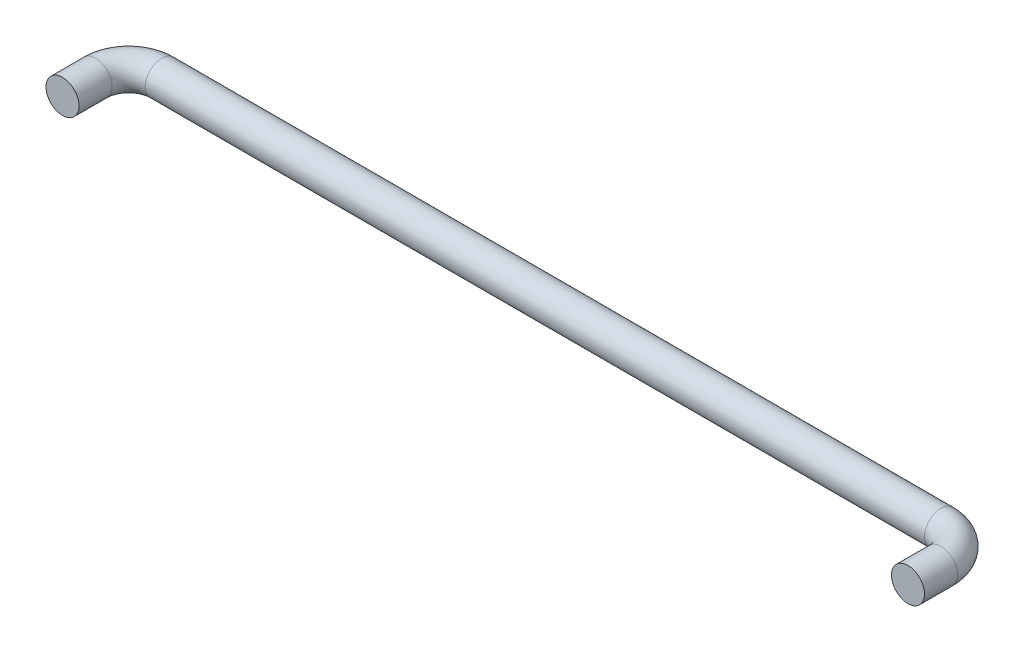
ISO-10303-21;
HEADER;
FILE_DESCRIPTION(('STEP AP214'),'2;1');
FILE_NAME('part.step','',(''),(''),'','','');
FILE_SCHEMA(('AUTOMOTIVE_DESIGN { 1 0 10303 214 1 1 1 1 }'));
ENDSEC;
DATA;
#1=APPLICATION_CONTEXT('core data for automotive mechanical design processes');
#2=APPLICATION_PROTOCOL_DEFINITION('international standard','automotive_design',2000,#1);
#3=PRODUCT_CONTEXT('',#1,'mechanical');
#4=PRODUCT('Part','Part','',(#3));
#5=PRODUCT_RELATED_PRODUCT_CATEGORY('part','',(#4));
#6=PRODUCT_DEFINITION_FORMATION('','',#4);
#7=PRODUCT_DEFINITION_CONTEXT('part definition',#1,'design');
#8=PRODUCT_DEFINITION('design','',#6,#7);
#9=PRODUCT_DEFINITION_SHAPE('','',#8);
#10=(LENGTH_UNIT() NAMED_UNIT(*) SI_UNIT(.MILLI.,.METRE.));
#11=(NAMED_UNIT(*) PLANE_ANGLE_UNIT() SI_UNIT($,.RADIAN.));
#12=(NAMED_UNIT(*) SI_UNIT($,.STERADIAN.) SOLID_ANGLE_UNIT());
#13=UNCERTAINTY_MEASURE_WITH_UNIT(LENGTH_MEASURE(1.E-05),#10,'distance_accuracy_value','');
#14=(GEOMETRIC_REPRESENTATION_CONTEXT(3) GLOBAL_UNCERTAINTY_ASSIGNED_CONTEXT((#13)) GLOBAL_UNIT_ASSIGNED_CONTEXT((#10,
#11,#12)) REPRESENTATION_CONTEXT('',''));
#15=CARTESIAN_POINT('',(0.,0.,0.));
#16=DIRECTION('',(0.,0.,1.));
#17=DIRECTION('',(1.,0.,0.));
#18=AXIS2_PLACEMENT_3D('',#15,#16,#17);
#19=CARTESIAN_POINT('',(0.,0.,0.));
#20=DIRECTION('',(0.,0.,1.));
#21=DIRECTION('',(1.,0.,0.));
#22=AXIS2_PLACEMENT_3D('',#19,#20,#21);
#23=PLANE('',#22);
#24=CARTESIAN_POINT('',(0.,0.,0.));
#25=DIRECTION('',(0.,0.,1.));
#26=DIRECTION('',(1.,0.,0.));
#27=AXIS2_PLACEMENT_3D('',#24,#25,#26);
#28=CIRCLE('',#27,25.);
#29=CARTESIAN_POINT('',(25.,0.,0.));
#30=VERTEX_POINT('',#29);
#31=EDGE_CURVE('E45',#30,#30,#28,.T.);
#32=ORIENTED_EDGE('',*,*,#31,.T.);
#33=EDGE_LOOP('',(#32));
#34=FACE_BOUND('',#33,.T.);
#35=ADVANCED_FACE('F33',(#34),#23,.T.);
#36=CARTESIAN_POINT('',(1278.6,0.,0.));
#37=DIRECTION('',(0.,0.,-1.));
#38=DIRECTION('',(-1.,0.,0.));
#39=AXIS2_PLACEMENT_3D('',#36,#37,#38);
#40=PLANE('',#39);
#41=CARTESIAN_POINT('',(1278.6,0.,0.));
#42=DIRECTION('',(0.,0.,-1.));
#43=DIRECTION('',(-1.,0.,0.));
#44=AXIS2_PLACEMENT_3D('',#41,#42,#43);
#45=CIRCLE('',#44,25.);
#46=CARTESIAN_POINT('',(1253.6,0.,0.));
#47=VERTEX_POINT('',#46);
#48=EDGE_CURVE('E11',#47,#47,#45,.T.);
#49=ORIENTED_EDGE('',*,*,#48,.F.);
#50=EDGE_LOOP('',(#49));
#51=FACE_BOUND('',#50,.T.);
#52=ADVANCED_FACE('F51',(#51),#40,.F.);
#53=CARTESIAN_POINT('',(0.,0.,0.));
#54=DIRECTION('',(0.,0.,-1.));
#55=DIRECTION('',(-1.,0.,0.));
#56=AXIS2_PLACEMENT_3D('',#53,#54,#55);
#57=CYLINDRICAL_SURFACE('',#56,25.);
#58=CARTESIAN_POINT('',(0.,0.,-49.9999999999997));
#59=DIRECTION('',(0.,0.,1.));
#60=DIRECTION('',(1.,0.,0.));
#61=AXIS2_PLACEMENT_3D('',#58,#59,#60);
#62=CIRCLE('',#61,25.);
#63=CARTESIAN_POINT('',(-25.,0.,-49.9999999999995));
#64=VERTEX_POINT('',#63);
#65=EDGE_CURVE('E85',#64,#64,#62,.T.);
#66=ORIENTED_EDGE('',*,*,#65,.T.);
#67=EDGE_LOOP('',(#66));
#68=FACE_BOUND('',#67,.T.);
#69=ORIENTED_EDGE('',*,*,#31,.F.);
#70=EDGE_LOOP('',(#69));
#71=FACE_BOUND('',#70,.T.);
#72=ADVANCED_FACE('F53',(#68,#71),#57,.T.);
#73=CARTESIAN_POINT('',(50.,0.,-50.));
#74=DIRECTION('',(0.,-1.,0.));
#75=DIRECTION('',(0.,0.,-1.));
#76=AXIS2_PLACEMENT_3D('',#73,#74,#75);
#77=TOROIDAL_SURFACE('',#76,50.,25.);
#78=CARTESIAN_POINT('',(50.0000000000003,0.,-100.));
#79=DIRECTION('',(-1.,0.,0.));
#80=DIRECTION('',(0.,0.,1.));
#81=AXIS2_PLACEMENT_3D('',#78,#79,#80);
#82=CIRCLE('',#81,25.);
#83=CARTESIAN_POINT('',(50.0000000000005,0.,-125.));
#84=VERTEX_POINT('',#83);
#85=EDGE_CURVE('E82',#84,#84,#82,.T.);
#86=CARTESIAN_POINT('',(50.,0.,-50.));
#87=DIRECTION('',(0.,-1.,0.));
#88=DIRECTION('',(0.,0.,-1.));
#89=AXIS2_PLACEMENT_3D('',#86,#87,#88);
#90=CIRCLE('',#89,75.);
#91=EDGE_CURVE('',#64,#84,#90,.T.);
#92=ORIENTED_EDGE('',*,*,#65,.F.);
#93=ORIENTED_EDGE('',*,*,#85,.T.);
#94=ORIENTED_EDGE('',*,*,#91,.T.);
#95=ORIENTED_EDGE('',*,*,#91,.F.);
#96=EDGE_LOOP('',(#92,#94,#93,#95));
#97=FACE_BOUND('',#96,.T.);
#98=ADVANCED_FACE('F58',(#97),#77,.T.);
#99=CARTESIAN_POINT('',(50.0000000000004,0.,-100.));
#100=DIRECTION('',(1.,0.,0.));
#101=DIRECTION('',(0.,0.,-1.));
#102=AXIS2_PLACEMENT_3D('',#99,#100,#101);
#103=CYLINDRICAL_SURFACE('',#102,25.);
#104=CARTESIAN_POINT('',(1228.6,0.,-100.));
#105=DIRECTION('',(-1.,0.,0.));
#106=DIRECTION('',(0.,0.,1.));
#107=AXIS2_PLACEMENT_3D('',#104,#105,#106);
#108=CIRCLE('',#107,25.);
#109=CARTESIAN_POINT('',(1228.6,0.,-125.));
#110=VERTEX_POINT('',#109);
#111=EDGE_CURVE('E87',#110,#110,#108,.T.);
#112=ORIENTED_EDGE('',*,*,#111,.T.);
#113=EDGE_LOOP('',(#112));
#114=FACE_BOUND('',#113,.T.);
#115=ORIENTED_EDGE('',*,*,#85,.F.);
#116=EDGE_LOOP('',(#115));
#117=FACE_BOUND('',#116,.T.);
#118=ADVANCED_FACE('F68',(#114,#117),#103,.T.);
#119=CARTESIAN_POINT('',(1228.6,0.,-50.));
#120=DIRECTION('',(0.,-1.,0.));
#121=DIRECTION('',(0.,0.,-1.));
#122=AXIS2_PLACEMENT_3D('',#119,#120,#121);
#123=TOROIDAL_SURFACE('',#122,50.,25.);
#124=CARTESIAN_POINT('',(1278.6,0.,-50.));
#125=DIRECTION('',(0.,0.,-1.));
#126=DIRECTION('',(-1.,0.,0.));
#127=AXIS2_PLACEMENT_3D('',#124,#125,#126);
#128=CIRCLE('',#127,25.);
#129=CARTESIAN_POINT('',(1303.6,0.,-50.));
#130=VERTEX_POINT('',#129);
#131=EDGE_CURVE('E40',#130,#130,#128,.T.);
#132=CARTESIAN_POINT('',(1228.6,0.,-50.));
#133=DIRECTION('',(0.,-1.,0.));
#134=DIRECTION('',(0.,0.,-1.));
#135=AXIS2_PLACEMENT_3D('',#132,#133,#134);
#136=CIRCLE('',#135,75.);
#137=EDGE_CURVE('',#110,#130,#136,.T.);
#138=ORIENTED_EDGE('',*,*,#111,.F.);
#139=ORIENTED_EDGE('',*,*,#131,.T.);
#140=ORIENTED_EDGE('',*,*,#137,.T.);
#141=ORIENTED_EDGE('',*,*,#137,.F.);
#142=EDGE_LOOP('',(#138,#140,#139,#141));
#143=FACE_BOUND('',#142,.T.);
#144=ADVANCED_FACE('F64',(#143),#123,.T.);
#145=CARTESIAN_POINT('',(1278.6,0.,-50.));
#146=DIRECTION('',(0.,0.,1.));
#147=DIRECTION('',(1.,0.,0.));
#148=AXIS2_PLACEMENT_3D('',#145,#146,#147);
#149=CYLINDRICAL_SURFACE('',#148,25.);
#150=ORIENTED_EDGE('',*,*,#48,.T.);
#151=EDGE_LOOP('',(#150));
#152=FACE_BOUND('',#151,.T.);
#153=ORIENTED_EDGE('',*,*,#131,.F.);
#154=EDGE_LOOP('',(#153));
#155=FACE_BOUND('',#154,.T.);
#156=ADVANCED_FACE('F48',(#152,#155),#149,.T.);
#157=CLOSED_SHELL('',(#35,#52,#72,#98,#118,#144,#156));
#158=MANIFOLD_SOLID_BREP('B2',#157);
#159=ADVANCED_BREP_SHAPE_REPRESENTATION('',(#18,#158),#14);
#160=SHAPE_DEFINITION_REPRESENTATION(#9,#159);
ENDSEC;
END-ISO-10303-21;
